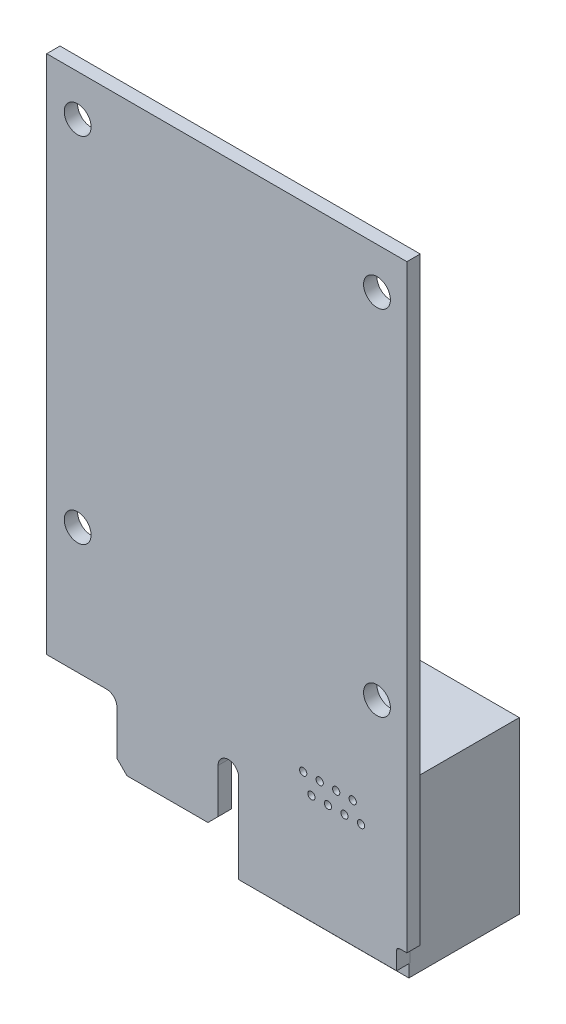
ISO-10303-21;
HEADER;
FILE_DESCRIPTION(('STEP AP214'),'2;1');
FILE_NAME('part.step','',(''),(''),'','','');
FILE_SCHEMA(('AUTOMOTIVE_DESIGN { 1 0 10303 214 1 1 1 1 }'));
ENDSEC;
DATA;
#1=APPLICATION_CONTEXT('core data for automotive mechanical design processes');
#2=APPLICATION_PROTOCOL_DEFINITION('international standard','automotive_design',2000,#1);
#3=PRODUCT_CONTEXT('',#1,'mechanical');
#4=PRODUCT('Part','Part','',(#3));
#5=PRODUCT_RELATED_PRODUCT_CATEGORY('part','',(#4));
#6=PRODUCT_DEFINITION_FORMATION('','',#4);
#7=PRODUCT_DEFINITION_CONTEXT('part definition',#1,'design');
#8=PRODUCT_DEFINITION('design','',#6,#7);
#9=PRODUCT_DEFINITION_SHAPE('','',#8);
#10=(LENGTH_UNIT() NAMED_UNIT(*) SI_UNIT(.MILLI.,.METRE.));
#11=(NAMED_UNIT(*) PLANE_ANGLE_UNIT() SI_UNIT($,.RADIAN.));
#12=(NAMED_UNIT(*) SI_UNIT($,.STERADIAN.) SOLID_ANGLE_UNIT());
#13=UNCERTAINTY_MEASURE_WITH_UNIT(LENGTH_MEASURE(1.E-05),#10,'distance_accuracy_value','');
#14=(GEOMETRIC_REPRESENTATION_CONTEXT(3) GLOBAL_UNCERTAINTY_ASSIGNED_CONTEXT((#13)) GLOBAL_UNIT_ASSIGNED_CONTEXT((#10,
#11,#12)) REPRESENTATION_CONTEXT('',''));
#15=CARTESIAN_POINT('',(0.,0.,0.));
#16=DIRECTION('',(0.,0.,1.));
#17=DIRECTION('',(1.,0.,0.));
#18=AXIS2_PLACEMENT_3D('',#15,#16,#17);
#19=CARTESIAN_POINT('',(-1.397,19.304,-15.2264872));
#20=DIRECTION('',(-1.,0.,0.));
#21=DIRECTION('',(0.,-1.,0.));
#22=AXIS2_PLACEMENT_3D('',#19,#20,#21);
#23=PLANE('',#22);
#24=DIRECTION('',(0.,-1.,0.));
#25=VECTOR('',#24,1.);
#26=CARTESIAN_POINT('',(-1.397,19.304,-1.6374872));
#27=LINE('',#26,#25);
#28=CARTESIAN_POINT('',(-1.397,19.304,-1.6374872));
#29=VERTEX_POINT('',#28);
#30=CARTESIAN_POINT('',(-1.397,0.,-1.6374872));
#31=VERTEX_POINT('',#30);
#32=EDGE_CURVE('E344',#29,#31,#27,.T.);
#33=ORIENTED_EDGE('',*,*,#32,.T.);
#34=CARTESIAN_POINT('',(-1.397,-1.651,-1.6374872));
#35=VERTEX_POINT('',#34);
#36=EDGE_CURVE('E332',#31,#35,#27,.T.);
#37=ORIENTED_EDGE('',*,*,#36,.T.);
#38=DIRECTION('',(0.,0.,1.));
#39=VECTOR('',#38,1.);
#40=CARTESIAN_POINT('',(-1.397,-1.651,-15.2264872));
#41=LINE('',#40,#39);
#42=CARTESIAN_POINT('',(-1.397,-1.651,-15.2264872));
#43=VERTEX_POINT('',#42);
#44=EDGE_CURVE('E362',#43,#35,#41,.T.);
#45=ORIENTED_EDGE('',*,*,#44,.F.);
#46=DIRECTION('',(0.,-1.,0.));
#47=VECTOR('',#46,1.);
#48=CARTESIAN_POINT('',(-1.397,19.304,-15.2264872));
#49=LINE('',#48,#47);
#50=CARTESIAN_POINT('',(-1.397,19.304,-15.2264872));
#51=VERTEX_POINT('',#50);
#52=EDGE_CURVE('E333',#51,#43,#49,.T.);
#53=ORIENTED_EDGE('',*,*,#52,.F.);
#54=DIRECTION('',(0.,0.,1.));
#55=VECTOR('',#54,1.);
#56=CARTESIAN_POINT('',(-1.397,19.304,-15.2264872));
#57=LINE('',#56,#55);
#58=EDGE_CURVE('E343',#51,#29,#57,.T.);
#59=ORIENTED_EDGE('',*,*,#58,.T.);
#60=EDGE_LOOP('',(#33,#37,#45,#53,#59));
#61=FACE_BOUND('',#60,.T.);
#62=ADVANCED_FACE('F39',(#61),#23,.F.);
#63=CARTESIAN_POINT('',(-1.397,-1.651,-15.2264872));
#64=DIRECTION('',(0.,1.,0.));
#65=DIRECTION('',(0.,0.,1.));
#66=AXIS2_PLACEMENT_3D('',#63,#64,#65);
#67=PLANE('',#66);
#68=DIRECTION('',(-1.,0.,0.));
#69=VECTOR('',#68,1.);
#70=CARTESIAN_POINT('',(-1.397,-1.651,-1.6374872));
#71=LINE('',#70,#69);
#72=CARTESIAN_POINT('',(-17.018,-1.651,-1.6374872));
#73=VERTEX_POINT('',#72);
#74=EDGE_CURVE('E347',#35,#73,#71,.T.);
#75=ORIENTED_EDGE('',*,*,#74,.T.);
#76=DIRECTION('',(0.,0.,1.));
#77=VECTOR('',#76,1.);
#78=CARTESIAN_POINT('',(-17.018,-1.651,-15.2264872));
#79=LINE('',#78,#77);
#80=CARTESIAN_POINT('',(-17.018,-1.651,-15.2264872));
#81=VERTEX_POINT('',#80);
#82=EDGE_CURVE('E359',#81,#73,#79,.T.);
#83=ORIENTED_EDGE('',*,*,#82,.F.);
#84=DIRECTION('',(-1.,0.,0.));
#85=VECTOR('',#84,1.);
#86=CARTESIAN_POINT('',(-1.397,-1.651,-15.2264872));
#87=LINE('',#86,#85);
#88=EDGE_CURVE('E336',#43,#81,#87,.T.);
#89=ORIENTED_EDGE('',*,*,#88,.F.);
#90=ORIENTED_EDGE('',*,*,#44,.T.);
#91=EDGE_LOOP('',(#75,#83,#89,#90));
#92=FACE_BOUND('',#91,.T.);
#93=ADVANCED_FACE('F465',(#92),#67,.F.);
#94=CARTESIAN_POINT('',(-17.018,19.304,-15.2264872));
#95=DIRECTION('',(1.,0.,0.));
#96=DIRECTION('',(0.,1.,0.));
#97=AXIS2_PLACEMENT_3D('',#94,#95,#96);
#98=PLANE('',#97);
#99=DIRECTION('',(0.,1.,0.));
#100=VECTOR('',#99,1.);
#101=CARTESIAN_POINT('',(-17.018,19.304,-1.6374872));
#102=LINE('',#101,#100);
#103=CARTESIAN_POINT('',(-17.018,0.,-1.6374872));
#104=VERTEX_POINT('',#103);
#105=EDGE_CURVE('E349',#73,#104,#102,.T.);
#106=ORIENTED_EDGE('',*,*,#105,.T.);
#107=DIRECTION('',(0.,1.,0.));
#108=VECTOR('',#107,1.);
#109=CARTESIAN_POINT('',(-17.018,19.304,-1.6374872));
#110=LINE('',#109,#108);
#111=CARTESIAN_POINT('',(-17.018,19.304,-1.6374872));
#112=VERTEX_POINT('',#111);
#113=EDGE_CURVE('E329',#104,#112,#110,.T.);
#114=ORIENTED_EDGE('',*,*,#113,.T.);
#115=DIRECTION('',(0.,0.,1.));
#116=VECTOR('',#115,1.);
#117=CARTESIAN_POINT('',(-17.018,19.304,-15.2264872));
#118=LINE('',#117,#116);
#119=CARTESIAN_POINT('',(-17.018,19.304,-15.2264872));
#120=VERTEX_POINT('',#119);
#121=EDGE_CURVE('E356',#120,#112,#118,.T.);
#122=ORIENTED_EDGE('',*,*,#121,.F.);
#123=DIRECTION('',(0.,1.,0.));
#124=VECTOR('',#123,1.);
#125=CARTESIAN_POINT('',(-17.018,19.304,-15.2264872));
#126=LINE('',#125,#124);
#127=EDGE_CURVE('E339',#81,#120,#126,.T.);
#128=ORIENTED_EDGE('',*,*,#127,.F.);
#129=ORIENTED_EDGE('',*,*,#82,.T.);
#130=EDGE_LOOP('',(#106,#114,#122,#128,#129));
#131=FACE_BOUND('',#130,.T.);
#132=ADVANCED_FACE('F471',(#131),#98,.F.);
#133=CARTESIAN_POINT('',(-1.397,19.304,-15.2264872));
#134=DIRECTION('',(0.,-1.,0.));
#135=DIRECTION('',(0.,0.,-1.));
#136=AXIS2_PLACEMENT_3D('',#133,#134,#135);
#137=PLANE('',#136);
#138=DIRECTION('',(1.,0.,0.));
#139=VECTOR('',#138,1.);
#140=CARTESIAN_POINT('',(-1.397,19.304,-1.6374872));
#141=LINE('',#140,#139);
#142=EDGE_CURVE('E337',#112,#29,#141,.T.);
#143=ORIENTED_EDGE('',*,*,#142,.T.);
#144=ORIENTED_EDGE('',*,*,#58,.F.);
#145=DIRECTION('',(1.,0.,0.));
#146=VECTOR('',#145,1.);
#147=CARTESIAN_POINT('',(-1.397,19.304,-15.2264872));
#148=LINE('',#147,#146);
#149=EDGE_CURVE('E341',#120,#51,#148,.T.);
#150=ORIENTED_EDGE('',*,*,#149,.F.);
#151=ORIENTED_EDGE('',*,*,#121,.T.);
#152=EDGE_LOOP('',(#143,#144,#150,#151));
#153=FACE_BOUND('',#152,.T.);
#154=ADVANCED_FACE('F476',(#153),#137,.F.);
#155=CARTESIAN_POINT('',(0.,0.,-15.2264872));
#156=DIRECTION('',(0.,0.,-1.));
#157=DIRECTION('',(-1.,0.,0.));
#158=AXIS2_PLACEMENT_3D('',#155,#156,#157);
#159=PLANE('',#158);
#160=ORIENTED_EDGE('',*,*,#52,.T.);
#161=ORIENTED_EDGE('',*,*,#88,.T.);
#162=ORIENTED_EDGE('',*,*,#127,.T.);
#163=ORIENTED_EDGE('',*,*,#149,.T.);
#164=EDGE_LOOP('',(#160,#161,#162,#163));
#165=FACE_BOUND('',#164,.T.);
#166=ADVANCED_FACE('F461',(#165),#159,.T.);
#167=CARTESIAN_POINT('',(0.,0.,-1.6374872));
#168=DIRECTION('',(0.,0.,-1.));
#169=DIRECTION('',(-1.,0.,0.));
#170=AXIS2_PLACEMENT_3D('',#167,#168,#169);
#171=PLANE('',#170);
#172=ORIENTED_EDGE('',*,*,#36,.F.);
#173=DIRECTION('',(-1.,0.,0.));
#174=VECTOR('',#173,1.);
#175=CARTESIAN_POINT('',(-41.783,0.,-1.6374872));
#176=LINE('',#175,#174);
#177=EDGE_CURVE('E323',#31,#104,#176,.T.);
#178=ORIENTED_EDGE('',*,*,#177,.T.);
#179=ORIENTED_EDGE('',*,*,#105,.F.);
#180=ORIENTED_EDGE('',*,*,#74,.F.);
#181=EDGE_LOOP('',(#172,#178,#179,#180));
#182=FACE_BOUND('',#181,.T.);
#183=ADVANCED_FACE('F448',(#182),#171,.F.);
#184=CARTESIAN_POINT('',(-41.783,5.4482365,-1.6374872));
#185=DIRECTION('',(0.,0.,-1.));
#186=DIRECTION('',(-1.,0.,0.));
#187=AXIS2_PLACEMENT_3D('',#184,#185,#186);
#188=PLANE('',#187);
#189=DIRECTION('',(-1.,0.,0.));
#190=VECTOR('',#189,1.);
#191=CARTESIAN_POINT('',(0.254,2.54,-1.6374872));
#192=LINE('',#191,#190);
#193=CARTESIAN_POINT('',(0.,2.54,-1.6374872));
#194=VERTEX_POINT('',#193);
#195=CARTESIAN_POINT('',(-0.888999999999999,2.54,-1.6374872));
#196=VERTEX_POINT('',#195);
#197=EDGE_CURVE('E195',#194,#196,#192,.T.);
#198=ORIENTED_EDGE('',*,*,#197,.T.);
#199=CARTESIAN_POINT('',(-0.888999999999999,2.159,-1.6374872));
#200=DIRECTION('',(0.,0.,-1.));
#201=DIRECTION('',(-1.,0.,0.));
#202=AXIS2_PLACEMENT_3D('',#199,#200,#201);
#203=CIRCLE('',#202,0.381);
#204=CARTESIAN_POINT('',(-1.27,2.159,-1.6374872));
#205=VERTEX_POINT('',#204);
#206=EDGE_CURVE('E184',#196,#205,#203,.F.);
#207=ORIENTED_EDGE('',*,*,#206,.T.);
#208=DIRECTION('',(0.,-1.,0.));
#209=VECTOR('',#208,1.);
#210=CARTESIAN_POINT('',(-1.27,-0.254,-1.6374872));
#211=LINE('',#210,#209);
#212=CARTESIAN_POINT('',(-1.27,0.,-1.6374872));
#213=VERTEX_POINT('',#212);
#214=EDGE_CURVE('E210',#205,#213,#211,.T.);
#215=ORIENTED_EDGE('',*,*,#214,.T.);
#216=EDGE_CURVE('E43',#213,#31,#176,.T.);
#217=ORIENTED_EDGE('',*,*,#216,.T.);
#218=ORIENTED_EDGE('',*,*,#32,.F.);
#219=ORIENTED_EDGE('',*,*,#142,.F.);
#220=ORIENTED_EDGE('',*,*,#113,.F.);
#221=CARTESIAN_POINT('',(-20.6989442868489,0.,-1.6374872));
#222=VERTEX_POINT('',#221);
#223=EDGE_CURVE('E64',#104,#222,#176,.T.);
#224=ORIENTED_EDGE('',*,*,#223,.T.);
#225=DIRECTION('',(0.,1.,0.));
#226=VECTOR('',#225,1.);
#227=CARTESIAN_POINT('',(-20.6989442868489,10.8966,-1.6374872));
#228=LINE('',#227,#226);
#229=CARTESIAN_POINT('',(-20.6989442868489,10.8966,-1.6374872));
#230=VERTEX_POINT('',#229);
#231=EDGE_CURVE('E217',#222,#230,#228,.T.);
#232=ORIENTED_EDGE('',*,*,#231,.T.);
#233=CARTESIAN_POINT('',(-21.9689442868489,10.8966,-1.6374872));
#234=DIRECTION('',(0.,0.,1.));
#235=DIRECTION('',(-1.,0.,0.));
#236=AXIS2_PLACEMENT_3D('',#233,#234,#235);
#237=CIRCLE('',#236,1.27);
#238=CARTESIAN_POINT('',(-23.2389442868489,10.8966,-1.6374872));
#239=VERTEX_POINT('',#238);
#240=EDGE_CURVE('E240',#230,#239,#237,.T.);
#241=ORIENTED_EDGE('',*,*,#240,.T.);
#242=DIRECTION('',(0.,-1.,0.));
#243=VECTOR('',#242,1.);
#244=CARTESIAN_POINT('',(-23.2389442868489,5.4356,-1.6374872));
#245=LINE('',#244,#243);
#246=CARTESIAN_POINT('',(-23.2389442868489,5.4356,-1.6374872));
#247=VERTEX_POINT('',#246);
#248=EDGE_CURVE('E237',#239,#247,#245,.T.);
#249=ORIENTED_EDGE('',*,*,#248,.T.);
#250=DIRECTION('',(-0.707106781186551,-0.707106781186544,0.));
#251=VECTOR('',#250,1.);
#252=CARTESIAN_POINT('',(-23.2389442868489,5.4356,-1.6374872));
#253=LINE('',#252,#251);
#254=CARTESIAN_POINT('',(-24.483544286849,4.191,-1.6374872));
#255=VERTEX_POINT('',#254);
#256=EDGE_CURVE('E234',#247,#255,#253,.T.);
#257=ORIENTED_EDGE('',*,*,#256,.T.);
#258=DIRECTION('',(-1.,0.,0.));
#259=VECTOR('',#258,1.);
#260=CARTESIAN_POINT('',(-34.440344286849,4.191,-1.6374872));
#261=LINE('',#260,#259);
#262=CARTESIAN_POINT('',(-34.440344286849,4.191,-1.6374872));
#263=VERTEX_POINT('',#262);
#264=EDGE_CURVE('E231',#255,#263,#261,.T.);
#265=ORIENTED_EDGE('',*,*,#264,.T.);
#266=DIRECTION('',(-0.707106781186544,0.707106781186551,0.));
#267=VECTOR('',#266,1.);
#268=CARTESIAN_POINT('',(-35.684944286849,5.4356,-1.6374872));
#269=LINE('',#268,#267);
#270=CARTESIAN_POINT('',(-35.684944286849,5.4356,-1.6374872));
#271=VERTEX_POINT('',#270);
#272=EDGE_CURVE('E228',#263,#271,#269,.T.);
#273=ORIENTED_EDGE('',*,*,#272,.T.);
#274=DIRECTION('',(0.,1.,0.));
#275=VECTOR('',#274,1.);
#276=CARTESIAN_POINT('',(-35.684944286849,10.8966,-1.6374872));
#277=LINE('',#276,#275);
#278=CARTESIAN_POINT('',(-35.684944286849,10.8966,-1.6374872));
#279=VERTEX_POINT('',#278);
#280=EDGE_CURVE('E225',#271,#279,#277,.T.);
#281=ORIENTED_EDGE('',*,*,#280,.T.);
#282=CARTESIAN_POINT('',(-36.954944286849,10.8966,-1.6374872));
#283=DIRECTION('',(0.,0.,1.));
#284=DIRECTION('',(-1.,0.,0.));
#285=AXIS2_PLACEMENT_3D('',#282,#283,#284);
#286=CIRCLE('',#285,1.27);
#287=CARTESIAN_POINT('',(-36.954944286849,12.1666,-1.6374872));
#288=VERTEX_POINT('',#287);
#289=EDGE_CURVE('E222',#279,#288,#286,.T.);
#290=ORIENTED_EDGE('',*,*,#289,.T.);
#291=DIRECTION('',(-1.,0.,0.));
#292=VECTOR('',#291,1.);
#293=CARTESIAN_POINT('',(-36.954944286849,12.1666,-1.6374872));
#294=LINE('',#293,#292);
#295=CARTESIAN_POINT('',(-44.323,12.1666,-1.6374872));
#296=VERTEX_POINT('',#295);
#297=EDGE_CURVE('E218',#288,#296,#294,.T.);
#298=ORIENTED_EDGE('',*,*,#297,.T.);
#299=DIRECTION('',(0.,1.,0.));
#300=VECTOR('',#299,1.);
#301=CARTESIAN_POINT('',(-44.323,5.4482365,-1.6374872));
#302=LINE('',#301,#300);
#303=CARTESIAN_POINT('',(-44.323,76.2,-1.6374872));
#304=VERTEX_POINT('',#303);
#305=EDGE_CURVE('E412',#296,#304,#302,.T.);
#306=ORIENTED_EDGE('',*,*,#305,.T.);
#307=DIRECTION('',(-1.,0.,0.));
#308=VECTOR('',#307,1.);
#309=CARTESIAN_POINT('',(-41.783,76.2,-1.6374872));
#310=LINE('',#309,#308);
#311=CARTESIAN_POINT('',(0.,76.2,-1.6374872));
#312=VERTEX_POINT('',#311);
#313=EDGE_CURVE('E546',#304,#312,#310,.F.);
#314=ORIENTED_EDGE('',*,*,#313,.T.);
#315=DIRECTION('',(0.,1.,0.));
#316=VECTOR('',#315,1.);
#317=CARTESIAN_POINT('',(0.,5.4482365,-1.6374872));
#318=LINE('',#317,#316);
#319=EDGE_CURVE('E204',#312,#194,#318,.F.);
#320=ORIENTED_EDGE('',*,*,#319,.T.);
#321=EDGE_LOOP('',(#198,#207,#215,#217,#218,#219,#220,#224,#232,#241,#249,#257,#265,#273,#281,
#290,#298,#306,#314,#320));
#322=FACE_BOUND('',#321,.T.);
#323=CARTESIAN_POINT('',(-3.68300000000001,71.12,-1.6374872));
#324=DIRECTION('',(0.,0.,-1.));
#325=DIRECTION('',(-1.,0.,0.));
#326=AXIS2_PLACEMENT_3D('',#323,#324,#325);
#327=CIRCLE('',#326,1.651);
#328=CARTESIAN_POINT('',(-5.334,71.12,-1.6374872));
#329=VERTEX_POINT('',#328);
#330=EDGE_CURVE('E307',#329,#329,#327,.T.);
#331=ORIENTED_EDGE('',*,*,#330,.F.);
#332=EDGE_LOOP('',(#331));
#333=FACE_BOUND('',#332,.T.);
#334=CARTESIAN_POINT('',(-3.68300000000001,27.6352,-1.6374872));
#335=DIRECTION('',(0.,0.,-1.));
#336=DIRECTION('',(-1.,0.,0.));
#337=AXIS2_PLACEMENT_3D('',#334,#335,#336);
#338=CIRCLE('',#337,1.651);
#339=CARTESIAN_POINT('',(-5.33400000000001,27.6352,-1.6374872));
#340=VERTEX_POINT('',#339);
#341=EDGE_CURVE('E304',#340,#340,#338,.T.);
#342=ORIENTED_EDGE('',*,*,#341,.F.);
#343=EDGE_LOOP('',(#342));
#344=FACE_BOUND('',#343,.T.);
#345=CARTESIAN_POINT('',(-40.513,27.6352,-1.6374872));
#346=DIRECTION('',(0.,0.,-1.));
#347=DIRECTION('',(-1.,0.,0.));
#348=AXIS2_PLACEMENT_3D('',#345,#346,#347);
#349=CIRCLE('',#348,1.651);
#350=CARTESIAN_POINT('',(-42.164,27.6352,-1.6374872));
#351=VERTEX_POINT('',#350);
#352=EDGE_CURVE('E296',#351,#351,#349,.T.);
#353=ORIENTED_EDGE('',*,*,#352,.F.);
#354=EDGE_LOOP('',(#353));
#355=FACE_BOUND('',#354,.T.);
#356=CARTESIAN_POINT('',(-40.513,71.12,-1.6374872));
#357=DIRECTION('',(0.,0.,-1.));
#358=DIRECTION('',(-1.,0.,0.));
#359=AXIS2_PLACEMENT_3D('',#356,#357,#358);
#360=CIRCLE('',#359,1.651);
#361=CARTESIAN_POINT('',(-42.164,71.12,-1.6374872));
#362=VERTEX_POINT('',#361);
#363=EDGE_CURVE('E313',#362,#362,#360,.T.);
#364=ORIENTED_EDGE('',*,*,#363,.F.);
#365=EDGE_LOOP('',(#364));
#366=FACE_BOUND('',#365,.T.);
#367=ADVANCED_FACE('F200',(#322,#333,#344,#355,#366),#188,.T.);
#368=CARTESIAN_POINT('',(-44.323,14.4652365,-1.6374872));
#369=DIRECTION('',(-1.,0.,0.));
#370=DIRECTION('',(0.,0.,1.));
#371=AXIS2_PLACEMENT_3D('',#368,#369,#370);
#372=PLANE('',#371);
#373=DIRECTION('',(0.,0.,1.));
#374=VECTOR('',#373,1.);
#375=CARTESIAN_POINT('',(-44.323,76.2,-1.6374872));
#376=LINE('',#375,#374);
#377=CARTESIAN_POINT('',(-44.323,76.2,0.));
#378=VERTEX_POINT('',#377);
#379=EDGE_CURVE('E403',#304,#378,#376,.T.);
#380=ORIENTED_EDGE('',*,*,#379,.F.);
#381=ORIENTED_EDGE('',*,*,#305,.F.);
#382=DIRECTION('',(0.,0.,-1.));
#383=VECTOR('',#382,1.);
#384=CARTESIAN_POINT('',(-44.323,12.1666,27.7225522722548));
#385=LINE('',#384,#383);
#386=CARTESIAN_POINT('',(-44.323,12.1666,1.47819500043167E-06));
#387=VERTEX_POINT('',#386);
#388=EDGE_CURVE('E251',#387,#296,#385,.T.);
#389=ORIENTED_EDGE('',*,*,#388,.F.);
#390=DIRECTION('',(0.,1.,0.));
#391=VECTOR('',#390,1.);
#392=CARTESIAN_POINT('',(-44.323,14.4652365,0.));
#393=LINE('',#392,#391);
#394=EDGE_CURVE('E315',#387,#378,#393,.T.);
#395=ORIENTED_EDGE('',*,*,#394,.T.);
#396=EDGE_LOOP('',(#380,#381,#389,#395));
#397=FACE_BOUND('',#396,.T.);
#398=ADVANCED_FACE('F542',(#397),#372,.T.);
#399=CARTESIAN_POINT('',(-44.323,76.2,-1.6374872));
#400=DIRECTION('',(0.,1.,0.));
#401=DIRECTION('',(0.,0.,1.));
#402=AXIS2_PLACEMENT_3D('',#399,#400,#401);
#403=PLANE('',#402);
#404=DIRECTION('',(0.,0.,-1.));
#405=VECTOR('',#404,1.);
#406=CARTESIAN_POINT('',(0.,76.2,-1.6374872));
#407=LINE('',#406,#405);
#408=CARTESIAN_POINT('',(0.,76.2,0.));
#409=VERTEX_POINT('',#408);
#410=EDGE_CURVE('E398',#312,#409,#407,.F.);
#411=ORIENTED_EDGE('',*,*,#410,.F.);
#412=ORIENTED_EDGE('',*,*,#313,.F.);
#413=ORIENTED_EDGE('',*,*,#379,.T.);
#414=DIRECTION('',(1.,0.,0.));
#415=VECTOR('',#414,1.);
#416=CARTESIAN_POINT('',(-44.323,76.2,0.));
#417=LINE('',#416,#415);
#418=EDGE_CURVE('E401',#378,#409,#417,.T.);
#419=ORIENTED_EDGE('',*,*,#418,.T.);
#420=EDGE_LOOP('',(#411,#412,#413,#419));
#421=FACE_BOUND('',#420,.T.);
#422=ADVANCED_FACE('F562',(#421),#403,.T.);
#423=CARTESIAN_POINT('',(0.,76.2,-1.6374872));
#424=DIRECTION('',(1.,0.,0.));
#425=DIRECTION('',(0.,0.,-1.));
#426=AXIS2_PLACEMENT_3D('',#423,#424,#425);
#427=PLANE('',#426);
#428=DIRECTION('',(0.,0.,1.));
#429=VECTOR('',#428,1.);
#430=CARTESIAN_POINT('',(0.,2.54,-1.6374872));
#431=LINE('',#430,#429);
#432=CARTESIAN_POINT('',(0.,2.54,0.));
#433=VERTEX_POINT('',#432);
#434=EDGE_CURVE('E215',#194,#433,#431,.T.);
#435=ORIENTED_EDGE('',*,*,#434,.F.);
#436=ORIENTED_EDGE('',*,*,#319,.F.);
#437=ORIENTED_EDGE('',*,*,#410,.T.);
#438=DIRECTION('',(0.,1.,0.));
#439=VECTOR('',#438,1.);
#440=CARTESIAN_POINT('',(0.,76.2,0.));
#441=LINE('',#440,#439);
#442=EDGE_CURVE('E390',#409,#433,#441,.F.);
#443=ORIENTED_EDGE('',*,*,#442,.T.);
#444=EDGE_LOOP('',(#435,#436,#437,#443));
#445=FACE_BOUND('',#444,.T.);
#446=ADVANCED_FACE('F559',(#445),#427,.T.);
#447=CARTESIAN_POINT('',(0.,0.,-1.6374872));
#448=DIRECTION('',(0.,-1.,0.));
#449=DIRECTION('',(0.,0.,-1.));
#450=AXIS2_PLACEMENT_3D('',#447,#448,#449);
#451=PLANE('',#450);
#452=DIRECTION('',(0.,0.,-1.));
#453=VECTOR('',#452,1.);
#454=CARTESIAN_POINT('',(-1.27,0.,-1.6374872));
#455=LINE('',#454,#453);
#456=CARTESIAN_POINT('',(-1.27,0.,0.));
#457=VERTEX_POINT('',#456);
#458=EDGE_CURVE('E211',#457,#213,#455,.T.);
#459=ORIENTED_EDGE('',*,*,#458,.F.);
#460=DIRECTION('',(1.,0.,0.));
#461=VECTOR('',#460,1.);
#462=CARTESIAN_POINT('',(0.,0.,0.));
#463=LINE('',#462,#461);
#464=CARTESIAN_POINT('',(-20.6989442868489,0.,1.47819500043167E-06));
#465=VERTEX_POINT('',#464);
#466=EDGE_CURVE('E388',#457,#465,#463,.F.);
#467=ORIENTED_EDGE('',*,*,#466,.T.);
#468=DIRECTION('',(0.,0.,-1.));
#469=VECTOR('',#468,1.);
#470=CARTESIAN_POINT('',(-20.6989442868489,0.,27.7225522722548));
#471=LINE('',#470,#469);
#472=EDGE_CURVE('E282',#465,#222,#471,.T.);
#473=ORIENTED_EDGE('',*,*,#472,.T.);
#474=ORIENTED_EDGE('',*,*,#223,.F.);
#475=ORIENTED_EDGE('',*,*,#177,.F.);
#476=ORIENTED_EDGE('',*,*,#216,.F.);
#477=EDGE_LOOP('',(#459,#467,#473,#474,#475,#476));
#478=FACE_BOUND('',#477,.T.);
#479=ADVANCED_FACE('F439',(#478),#451,.T.);
#480=CARTESIAN_POINT('',(-11.7475,13.4366,-1.6374872));
#481=DIRECTION('',(0.,0.,-1.));
#482=DIRECTION('',(-1.,0.,0.));
#483=AXIS2_PLACEMENT_3D('',#480,#481,#482);
#484=CYLINDRICAL_SURFACE('',#483,0.4445);
#485=CARTESIAN_POINT('',(-11.7475,13.4366,0.));
#486=DIRECTION('',(0.,0.,-1.));
#487=DIRECTION('',(-1.,0.,0.));
#488=AXIS2_PLACEMENT_3D('',#485,#486,#487);
#489=CIRCLE('',#488,0.4445);
#490=CARTESIAN_POINT('',(-12.192,13.4366,0.));
#491=VERTEX_POINT('',#490);
#492=EDGE_CURVE('E326',#491,#491,#489,.T.);
#493=ORIENTED_EDGE('',*,*,#492,.F.);
#494=EDGE_LOOP('',(#493));
#495=FACE_BOUND('',#494,.T.);
#496=CARTESIAN_POINT('',(-11.7475,13.4366,-1.6374872));
#497=DIRECTION('',(0.,0.,-1.));
#498=DIRECTION('',(-1.,0.,0.));
#499=AXIS2_PLACEMENT_3D('',#496,#497,#498);
#500=CIRCLE('',#499,0.4445);
#501=CARTESIAN_POINT('',(-12.192,13.4366,-1.6374872));
#502=VERTEX_POINT('',#501);
#503=EDGE_CURVE('E49',#502,#502,#500,.T.);
#504=ORIENTED_EDGE('',*,*,#503,.T.);
#505=EDGE_LOOP('',(#504));
#506=FACE_BOUND('',#505,.T.);
#507=ADVANCED_FACE('F435',(#495,#506),#484,.F.);
#508=CARTESIAN_POINT('',(-7.6835,13.4366,-1.6374872));
#509=DIRECTION('',(0.,0.,-1.));
#510=DIRECTION('',(-1.,0.,0.));
#511=AXIS2_PLACEMENT_3D('',#508,#509,#510);
#512=CYLINDRICAL_SURFACE('',#511,0.4445);
#513=CARTESIAN_POINT('',(-7.6835,13.4366,0.));
#514=DIRECTION('',(0.,0.,-1.));
#515=DIRECTION('',(-1.,0.,0.));
#516=AXIS2_PLACEMENT_3D('',#513,#514,#515);
#517=CIRCLE('',#516,0.4445);
#518=CARTESIAN_POINT('',(-8.128,13.4366,0.));
#519=VERTEX_POINT('',#518);
#520=EDGE_CURVE('E427',#519,#519,#517,.T.);
#521=ORIENTED_EDGE('',*,*,#520,.F.);
#522=EDGE_LOOP('',(#521));
#523=FACE_BOUND('',#522,.T.);
#524=CARTESIAN_POINT('',(-7.6835,13.4366,-1.6374872));
#525=DIRECTION('',(0.,0.,-1.));
#526=DIRECTION('',(-1.,0.,0.));
#527=AXIS2_PLACEMENT_3D('',#524,#525,#526);
#528=CIRCLE('',#527,0.4445);
#529=CARTESIAN_POINT('',(-8.128,13.4366,-1.6374872));
#530=VERTEX_POINT('',#529);
#531=EDGE_CURVE('E383',#530,#530,#528,.T.);
#532=ORIENTED_EDGE('',*,*,#531,.T.);
#533=EDGE_LOOP('',(#532));
#534=FACE_BOUND('',#533,.T.);
#535=ADVANCED_FACE('F438',(#523,#534),#512,.F.);
#536=CARTESIAN_POINT('',(-9.7155,13.43660254,-1.6374872));
#537=DIRECTION('',(0.,0.,-1.));
#538=DIRECTION('',(-1.,0.,0.));
#539=AXIS2_PLACEMENT_3D('',#536,#537,#538);
#540=CYLINDRICAL_SURFACE('',#539,0.4445);
#541=CARTESIAN_POINT('',(-9.7155,13.43660254,0.));
#542=DIRECTION('',(0.,0.,-1.));
#543=DIRECTION('',(-1.,0.,0.));
#544=AXIS2_PLACEMENT_3D('',#541,#542,#543);
#545=CIRCLE('',#544,0.4445);
#546=CARTESIAN_POINT('',(-10.16,13.43660254,0.));
#547=VERTEX_POINT('',#546);
#548=EDGE_CURVE('E425',#547,#547,#545,.T.);
#549=ORIENTED_EDGE('',*,*,#548,.F.);
#550=EDGE_LOOP('',(#549));
#551=FACE_BOUND('',#550,.T.);
#552=CARTESIAN_POINT('',(-9.7155,13.43660254,-1.6374872));
#553=DIRECTION('',(0.,0.,-1.));
#554=DIRECTION('',(-1.,0.,0.));
#555=AXIS2_PLACEMENT_3D('',#552,#553,#554);
#556=CIRCLE('',#555,0.4445);
#557=CARTESIAN_POINT('',(-10.16,13.43660254,-1.6374872));
#558=VERTEX_POINT('',#557);
#559=EDGE_CURVE('E380',#558,#558,#556,.T.);
#560=ORIENTED_EDGE('',*,*,#559,.T.);
#561=EDGE_LOOP('',(#560));
#562=FACE_BOUND('',#561,.T.);
#563=ADVANCED_FACE('F577',(#551,#562),#540,.F.);
#564=CARTESIAN_POINT('',(-12.7635,15.4686,-1.6374872));
#565=DIRECTION('',(0.,0.,-1.));
#566=DIRECTION('',(-1.,0.,0.));
#567=AXIS2_PLACEMENT_3D('',#564,#565,#566);
#568=CYLINDRICAL_SURFACE('',#567,0.4445);
#569=CARTESIAN_POINT('',(-12.7635,15.4686,0.));
#570=DIRECTION('',(0.,0.,-1.));
#571=DIRECTION('',(-1.,0.,0.));
#572=AXIS2_PLACEMENT_3D('',#569,#570,#571);
#573=CIRCLE('',#572,0.4445);
#574=CARTESIAN_POINT('',(-13.208,15.4686,0.));
#575=VERTEX_POINT('',#574);
#576=EDGE_CURVE('E422',#575,#575,#573,.T.);
#577=ORIENTED_EDGE('',*,*,#576,.F.);
#578=EDGE_LOOP('',(#577));
#579=FACE_BOUND('',#578,.T.);
#580=CARTESIAN_POINT('',(-12.7635,15.4686,-1.6374872));
#581=DIRECTION('',(0.,0.,-1.));
#582=DIRECTION('',(-1.,0.,0.));
#583=AXIS2_PLACEMENT_3D('',#580,#581,#582);
#584=CIRCLE('',#583,0.4445);
#585=CARTESIAN_POINT('',(-13.208,15.4686,-1.6374872));
#586=VERTEX_POINT('',#585);
#587=EDGE_CURVE('E377',#586,#586,#584,.T.);
#588=ORIENTED_EDGE('',*,*,#587,.T.);
#589=EDGE_LOOP('',(#588));
#590=FACE_BOUND('',#589,.T.);
#591=ADVANCED_FACE('F581',(#579,#590),#568,.F.);
#592=CARTESIAN_POINT('',(-8.6995,15.4686,-1.6374872));
#593=DIRECTION('',(0.,0.,-1.));
#594=DIRECTION('',(-1.,0.,0.));
#595=AXIS2_PLACEMENT_3D('',#592,#593,#594);
#596=CYLINDRICAL_SURFACE('',#595,0.4445);
#597=CARTESIAN_POINT('',(-8.6995,15.4686,0.));
#598=DIRECTION('',(0.,0.,-1.));
#599=DIRECTION('',(-1.,0.,0.));
#600=AXIS2_PLACEMENT_3D('',#597,#598,#599);
#601=CIRCLE('',#600,0.4445);
#602=CARTESIAN_POINT('',(-9.144,15.4686,0.));
#603=VERTEX_POINT('',#602);
#604=EDGE_CURVE('E419',#603,#603,#601,.T.);
#605=ORIENTED_EDGE('',*,*,#604,.F.);
#606=EDGE_LOOP('',(#605));
#607=FACE_BOUND('',#606,.T.);
#608=CARTESIAN_POINT('',(-8.6995,15.4686,-1.6374872));
#609=DIRECTION('',(0.,0.,-1.));
#610=DIRECTION('',(-1.,0.,0.));
#611=AXIS2_PLACEMENT_3D('',#608,#609,#610);
#612=CIRCLE('',#611,0.4445);
#613=CARTESIAN_POINT('',(-9.144,15.4686,-1.6374872));
#614=VERTEX_POINT('',#613);
#615=EDGE_CURVE('E374',#614,#614,#612,.T.);
#616=ORIENTED_EDGE('',*,*,#615,.T.);
#617=EDGE_LOOP('',(#616));
#618=FACE_BOUND('',#617,.T.);
#619=ADVANCED_FACE('F585',(#607,#618),#596,.F.);
#620=CARTESIAN_POINT('',(-10.7315,15.4686,-1.6374872));
#621=DIRECTION('',(0.,0.,-1.));
#622=DIRECTION('',(-1.,0.,0.));
#623=AXIS2_PLACEMENT_3D('',#620,#621,#622);
#624=CYLINDRICAL_SURFACE('',#623,0.4445);
#625=CARTESIAN_POINT('',(-10.7315,15.4686,0.));
#626=DIRECTION('',(0.,0.,-1.));
#627=DIRECTION('',(-1.,0.,0.));
#628=AXIS2_PLACEMENT_3D('',#625,#626,#627);
#629=CIRCLE('',#628,0.4445);
#630=CARTESIAN_POINT('',(-11.176,15.4686,0.));
#631=VERTEX_POINT('',#630);
#632=EDGE_CURVE('E416',#631,#631,#629,.T.);
#633=ORIENTED_EDGE('',*,*,#632,.F.);
#634=EDGE_LOOP('',(#633));
#635=FACE_BOUND('',#634,.T.);
#636=CARTESIAN_POINT('',(-10.7315,15.4686,-1.6374872));
#637=DIRECTION('',(0.,0.,-1.));
#638=DIRECTION('',(-1.,0.,0.));
#639=AXIS2_PLACEMENT_3D('',#636,#637,#638);
#640=CIRCLE('',#639,0.4445);
#641=CARTESIAN_POINT('',(-11.176,15.4686,-1.6374872));
#642=VERTEX_POINT('',#641);
#643=EDGE_CURVE('E371',#642,#642,#640,.T.);
#644=ORIENTED_EDGE('',*,*,#643,.T.);
#645=EDGE_LOOP('',(#644));
#646=FACE_BOUND('',#645,.T.);
#647=ADVANCED_FACE('F589',(#635,#646),#624,.F.);
#648=CARTESIAN_POINT('',(-6.6675,15.4686,-1.6374872));
#649=DIRECTION('',(0.,0.,-1.));
#650=DIRECTION('',(-1.,0.,0.));
#651=AXIS2_PLACEMENT_3D('',#648,#649,#650);
#652=CYLINDRICAL_SURFACE('',#651,0.4445);
#653=CARTESIAN_POINT('',(-6.6675,15.4686,0.));
#654=DIRECTION('',(0.,0.,-1.));
#655=DIRECTION('',(-1.,0.,0.));
#656=AXIS2_PLACEMENT_3D('',#653,#654,#655);
#657=CIRCLE('',#656,0.4445);
#658=CARTESIAN_POINT('',(-7.112,15.4686,0.));
#659=VERTEX_POINT('',#658);
#660=EDGE_CURVE('E413',#659,#659,#657,.T.);
#661=ORIENTED_EDGE('',*,*,#660,.F.);
#662=EDGE_LOOP('',(#661));
#663=FACE_BOUND('',#662,.T.);
#664=CARTESIAN_POINT('',(-6.6675,15.4686,-1.6374872));
#665=DIRECTION('',(0.,0.,-1.));
#666=DIRECTION('',(-1.,0.,0.));
#667=AXIS2_PLACEMENT_3D('',#664,#665,#666);
#668=CIRCLE('',#667,0.4445);
#669=CARTESIAN_POINT('',(-7.112,15.4686,-1.6374872));
#670=VERTEX_POINT('',#669);
#671=EDGE_CURVE('E368',#670,#670,#668,.T.);
#672=ORIENTED_EDGE('',*,*,#671,.T.);
#673=EDGE_LOOP('',(#672));
#674=FACE_BOUND('',#673,.T.);
#675=ADVANCED_FACE('F593',(#663,#674),#652,.F.);
#676=CARTESIAN_POINT('',(-5.6515,13.4366,-1.6374872));
#677=DIRECTION('',(0.,0.,-1.));
#678=DIRECTION('',(-1.,0.,0.));
#679=AXIS2_PLACEMENT_3D('',#676,#677,#678);
#680=CYLINDRICAL_SURFACE('',#679,0.4445);
#681=CARTESIAN_POINT('',(-5.6515,13.4366,0.));
#682=DIRECTION('',(0.,0.,-1.));
#683=DIRECTION('',(-1.,0.,0.));
#684=AXIS2_PLACEMENT_3D('',#681,#682,#683);
#685=CIRCLE('',#684,0.4445);
#686=CARTESIAN_POINT('',(-6.096,13.4366,0.));
#687=VERTEX_POINT('',#686);
#688=EDGE_CURVE('E409',#687,#687,#685,.T.);
#689=ORIENTED_EDGE('',*,*,#688,.F.);
#690=EDGE_LOOP('',(#689));
#691=FACE_BOUND('',#690,.T.);
#692=CARTESIAN_POINT('',(-5.6515,13.4366,-1.6374872));
#693=DIRECTION('',(0.,0.,-1.));
#694=DIRECTION('',(-1.,0.,0.));
#695=AXIS2_PLACEMENT_3D('',#692,#693,#694);
#696=CIRCLE('',#695,0.4445);
#697=CARTESIAN_POINT('',(-6.096,13.4366,-1.6374872));
#698=VERTEX_POINT('',#697);
#699=EDGE_CURVE('E365',#698,#698,#696,.T.);
#700=ORIENTED_EDGE('',*,*,#699,.T.);
#701=EDGE_LOOP('',(#700));
#702=FACE_BOUND('',#701,.T.);
#703=ADVANCED_FACE('F597',(#691,#702),#680,.F.);
#704=CARTESIAN_POINT('',(-14.92250292968,6.826759544189,1.47819499956431E-06));
#705=DIRECTION('',(0.,0.,1.));
#706=DIRECTION('',(1.,0.,0.));
#707=AXIS2_PLACEMENT_3D('',#704,#705,#706);
#708=PLANE('',#707);
#709=DIRECTION('',(-1.,0.,0.));
#710=VECTOR('',#709,1.);
#711=CARTESIAN_POINT('',(-14.92250292968,2.53999999999999,1.47819499956431E-06));
#712=LINE('',#711,#710);
#713=CARTESIAN_POINT('',(-0.888999999999999,2.54,0.));
#714=VERTEX_POINT('',#713);
#715=EDGE_CURVE('E11',#433,#714,#712,.T.);
#716=ORIENTED_EDGE('',*,*,#715,.F.);
#717=ORIENTED_EDGE('',*,*,#442,.F.);
#718=ORIENTED_EDGE('',*,*,#418,.F.);
#719=ORIENTED_EDGE('',*,*,#394,.F.);
#720=DIRECTION('',(-1.,0.,0.));
#721=VECTOR('',#720,1.);
#722=CARTESIAN_POINT('',(-36.954944286849,12.1666,1.47819500043167E-06));
#723=LINE('',#722,#721);
#724=CARTESIAN_POINT('',(-36.954944286849,12.1666,1.47819500043167E-06));
#725=VERTEX_POINT('',#724);
#726=EDGE_CURVE('E248',#725,#387,#723,.T.);
#727=ORIENTED_EDGE('',*,*,#726,.F.);
#728=CARTESIAN_POINT('',(-36.954944286849,10.8966,1.47819500043167E-06));
#729=DIRECTION('',(0.,0.,1.));
#730=DIRECTION('',(1.,0.,0.));
#731=AXIS2_PLACEMENT_3D('',#728,#729,#730);
#732=CIRCLE('',#731,1.27);
#733=CARTESIAN_POINT('',(-35.684944286849,10.8966,1.47819500043167E-06));
#734=VERTEX_POINT('',#733);
#735=EDGE_CURVE('E253',#734,#725,#732,.T.);
#736=ORIENTED_EDGE('',*,*,#735,.F.);
#737=DIRECTION('',(0.,1.,0.));
#738=VECTOR('',#737,1.);
#739=CARTESIAN_POINT('',(-35.684944286849,10.8966,1.47819500043167E-06));
#740=LINE('',#739,#738);
#741=CARTESIAN_POINT('',(-35.684944286849,5.4356,1.47819500043167E-06));
#742=VERTEX_POINT('',#741);
#743=EDGE_CURVE('E257',#742,#734,#740,.T.);
#744=ORIENTED_EDGE('',*,*,#743,.F.);
#745=DIRECTION('',(-0.707106781186544,0.707106781186551,0.));
#746=VECTOR('',#745,1.);
#747=CARTESIAN_POINT('',(-35.684944286849,5.4356,1.47819500043167E-06));
#748=LINE('',#747,#746);
#749=CARTESIAN_POINT('',(-34.440344286849,4.191,1.47819500043167E-06));
#750=VERTEX_POINT('',#749);
#751=EDGE_CURVE('E261',#750,#742,#748,.T.);
#752=ORIENTED_EDGE('',*,*,#751,.F.);
#753=DIRECTION('',(-1.,0.,0.));
#754=VECTOR('',#753,1.);
#755=CARTESIAN_POINT('',(-34.440344286849,4.191,1.47819500043167E-06));
#756=LINE('',#755,#754);
#757=CARTESIAN_POINT('',(-24.483544286849,4.191,1.47819500043167E-06));
#758=VERTEX_POINT('',#757);
#759=EDGE_CURVE('E265',#758,#750,#756,.T.);
#760=ORIENTED_EDGE('',*,*,#759,.F.);
#761=DIRECTION('',(-0.707106781186551,-0.707106781186544,0.));
#762=VECTOR('',#761,1.);
#763=CARTESIAN_POINT('',(-23.2389442868489,5.4356,1.47819500043167E-06));
#764=LINE('',#763,#762);
#765=CARTESIAN_POINT('',(-23.2389442868489,5.4356,1.47819500043167E-06));
#766=VERTEX_POINT('',#765);
#767=EDGE_CURVE('E269',#766,#758,#764,.T.);
#768=ORIENTED_EDGE('',*,*,#767,.F.);
#769=DIRECTION('',(0.,-1.,0.));
#770=VECTOR('',#769,1.);
#771=CARTESIAN_POINT('',(-23.2389442868489,5.4356,1.47819500043167E-06));
#772=LINE('',#771,#770);
#773=CARTESIAN_POINT('',(-23.238944286849,10.8966,1.47819500043167E-06));
#774=VERTEX_POINT('',#773);
#775=EDGE_CURVE('E273',#774,#766,#772,.T.);
#776=ORIENTED_EDGE('',*,*,#775,.F.);
#777=CARTESIAN_POINT('',(-21.9689442868489,10.8966,1.47819500043167E-06));
#778=DIRECTION('',(0.,0.,1.));
#779=DIRECTION('',(1.,0.,0.));
#780=AXIS2_PLACEMENT_3D('',#777,#778,#779);
#781=CIRCLE('',#780,1.27);
#782=CARTESIAN_POINT('',(-20.6989442868489,10.8966,1.47819500737056E-06));
#783=VERTEX_POINT('',#782);
#784=EDGE_CURVE('E277',#783,#774,#781,.T.);
#785=ORIENTED_EDGE('',*,*,#784,.F.);
#786=DIRECTION('',(0.,1.,0.));
#787=VECTOR('',#786,1.);
#788=CARTESIAN_POINT('',(-20.6989442868489,10.8966,1.47819500043167E-06));
#789=LINE('',#788,#787);
#790=EDGE_CURVE('E221',#465,#783,#789,.T.);
#791=ORIENTED_EDGE('',*,*,#790,.F.);
#792=ORIENTED_EDGE('',*,*,#466,.F.);
#793=DIRECTION('',(0.,-1.,0.));
#794=VECTOR('',#793,1.);
#795=CARTESIAN_POINT('',(-1.27,-0.254,0.));
#796=LINE('',#795,#794);
#797=CARTESIAN_POINT('',(-1.27,2.159,1.47819499956431E-06));
#798=VERTEX_POINT('',#797);
#799=EDGE_CURVE('E205',#798,#457,#796,.T.);
#800=ORIENTED_EDGE('',*,*,#799,.F.);
#801=CARTESIAN_POINT('',(-0.888999999999999,2.159,0.));
#802=DIRECTION('',(0.,0.,1.));
#803=DIRECTION('',(1.,0.,0.));
#804=AXIS2_PLACEMENT_3D('',#801,#802,#803);
#805=CIRCLE('',#804,0.381);
#806=EDGE_CURVE('E56',#714,#798,#805,.T.);
#807=ORIENTED_EDGE('',*,*,#806,.F.);
#808=EDGE_LOOP('',(#716,#717,#718,#719,#727,#736,#744,#752,#760,#768,#776,#785,#791,#792,#800,#807));
#809=FACE_BOUND('',#808,.T.);
#810=CARTESIAN_POINT('',(-3.68300000000001,71.12,0.));
#811=DIRECTION('',(0.,0.,1.));
#812=DIRECTION('',(1.,0.,0.));
#813=AXIS2_PLACEMENT_3D('',#810,#811,#812);
#814=CIRCLE('',#813,1.651);
#815=CARTESIAN_POINT('',(-2.03200000000001,71.12,0.));
#816=VERTEX_POINT('',#815);
#817=EDGE_CURVE('E293',#816,#816,#814,.T.);
#818=ORIENTED_EDGE('',*,*,#817,.F.);
#819=EDGE_LOOP('',(#818));
#820=FACE_BOUND('',#819,.T.);
#821=CARTESIAN_POINT('',(-3.68300000000001,27.6352,0.));
#822=DIRECTION('',(0.,0.,1.));
#823=DIRECTION('',(1.,0.,0.));
#824=AXIS2_PLACEMENT_3D('',#821,#822,#823);
#825=CIRCLE('',#824,1.651);
#826=CARTESIAN_POINT('',(-2.03200000000001,27.6352,0.));
#827=VERTEX_POINT('',#826);
#828=EDGE_CURVE('E297',#827,#827,#825,.T.);
#829=ORIENTED_EDGE('',*,*,#828,.F.);
#830=EDGE_LOOP('',(#829));
#831=FACE_BOUND('',#830,.T.);
#832=CARTESIAN_POINT('',(-40.513,27.6352,0.));
#833=DIRECTION('',(0.,0.,1.));
#834=DIRECTION('',(1.,0.,0.));
#835=AXIS2_PLACEMENT_3D('',#832,#833,#834);
#836=CIRCLE('',#835,1.651);
#837=CARTESIAN_POINT('',(-38.862,27.6352,0.));
#838=VERTEX_POINT('',#837);
#839=EDGE_CURVE('E292',#838,#838,#836,.T.);
#840=ORIENTED_EDGE('',*,*,#839,.F.);
#841=EDGE_LOOP('',(#840));
#842=FACE_BOUND('',#841,.T.);
#843=CARTESIAN_POINT('',(-40.513,71.12,0.));
#844=DIRECTION('',(0.,0.,1.));
#845=DIRECTION('',(1.,0.,0.));
#846=AXIS2_PLACEMENT_3D('',#843,#844,#845);
#847=CIRCLE('',#846,1.651);
#848=CARTESIAN_POINT('',(-38.862,71.12,0.));
#849=VERTEX_POINT('',#848);
#850=EDGE_CURVE('E310',#849,#849,#847,.T.);
#851=ORIENTED_EDGE('',*,*,#850,.F.);
#852=EDGE_LOOP('',(#851));
#853=FACE_BOUND('',#852,.T.);
#854=ORIENTED_EDGE('',*,*,#688,.T.);
#855=EDGE_LOOP('',(#854));
#856=FACE_BOUND('',#855,.T.);
#857=ORIENTED_EDGE('',*,*,#660,.T.);
#858=EDGE_LOOP('',(#857));
#859=FACE_BOUND('',#858,.T.);
#860=ORIENTED_EDGE('',*,*,#632,.T.);
#861=EDGE_LOOP('',(#860));
#862=FACE_BOUND('',#861,.T.);
#863=ORIENTED_EDGE('',*,*,#604,.T.);
#864=EDGE_LOOP('',(#863));
#865=FACE_BOUND('',#864,.T.);
#866=ORIENTED_EDGE('',*,*,#576,.T.);
#867=EDGE_LOOP('',(#866));
#868=FACE_BOUND('',#867,.T.);
#869=ORIENTED_EDGE('',*,*,#548,.T.);
#870=EDGE_LOOP('',(#869));
#871=FACE_BOUND('',#870,.T.);
#872=ORIENTED_EDGE('',*,*,#520,.T.);
#873=EDGE_LOOP('',(#872));
#874=FACE_BOUND('',#873,.T.);
#875=ORIENTED_EDGE('',*,*,#492,.T.);
#876=EDGE_LOOP('',(#875));
#877=FACE_BOUND('',#876,.T.);
#878=ADVANCED_FACE('F41',(#809,#820,#831,#842,#853,#856,#859,#862,#865,#868,#871,#874,#877),
#708,.T.);
#879=ORIENTED_EDGE('',*,*,#699,.F.);
#880=EDGE_LOOP('',(#879));
#881=FACE_BOUND('',#880,.T.);
#882=ADVANCED_FACE('F463',(#881),#171,.F.);
#883=ORIENTED_EDGE('',*,*,#671,.F.);
#884=EDGE_LOOP('',(#883));
#885=FACE_BOUND('',#884,.T.);
#886=ADVANCED_FACE('F748',(#885),#171,.F.);
#887=ORIENTED_EDGE('',*,*,#643,.F.);
#888=EDGE_LOOP('',(#887));
#889=FACE_BOUND('',#888,.T.);
#890=ADVANCED_FACE('F739',(#889),#171,.F.);
#891=ORIENTED_EDGE('',*,*,#615,.F.);
#892=EDGE_LOOP('',(#891));
#893=FACE_BOUND('',#892,.T.);
#894=ADVANCED_FACE('F730',(#893),#171,.F.);
#895=ORIENTED_EDGE('',*,*,#587,.F.);
#896=EDGE_LOOP('',(#895));
#897=FACE_BOUND('',#896,.T.);
#898=ADVANCED_FACE('F721',(#897),#171,.F.);
#899=ORIENTED_EDGE('',*,*,#559,.F.);
#900=EDGE_LOOP('',(#899));
#901=FACE_BOUND('',#900,.T.);
#902=ADVANCED_FACE('F456',(#901),#171,.F.);
#903=ORIENTED_EDGE('',*,*,#531,.F.);
#904=EDGE_LOOP('',(#903));
#905=FACE_BOUND('',#904,.T.);
#906=ADVANCED_FACE('F446',(#905),#171,.F.);
#907=ORIENTED_EDGE('',*,*,#503,.F.);
#908=EDGE_LOOP('',(#907));
#909=FACE_BOUND('',#908,.T.);
#910=ADVANCED_FACE('F443',(#909),#171,.F.);
#911=CARTESIAN_POINT('',(-40.513,71.12,-2.54));
#912=DIRECTION('',(0.,0.,1.));
#913=DIRECTION('',(1.,0.,0.));
#914=AXIS2_PLACEMENT_3D('',#911,#912,#913);
#915=CYLINDRICAL_SURFACE('',#914,1.651);
#916=ORIENTED_EDGE('',*,*,#363,.T.);
#917=EDGE_LOOP('',(#916));
#918=FACE_BOUND('',#917,.T.);
#919=ORIENTED_EDGE('',*,*,#850,.T.);
#920=EDGE_LOOP('',(#919));
#921=FACE_BOUND('',#920,.T.);
#922=ADVANCED_FACE('F445',(#918,#921),#915,.F.);
#923=CARTESIAN_POINT('',(-40.513,27.6352,-2.54));
#924=DIRECTION('',(0.,0.,1.));
#925=DIRECTION('',(1.,0.,0.));
#926=AXIS2_PLACEMENT_3D('',#923,#924,#925);
#927=CYLINDRICAL_SURFACE('',#926,1.651);
#928=ORIENTED_EDGE('',*,*,#352,.T.);
#929=EDGE_LOOP('',(#928));
#930=FACE_BOUND('',#929,.T.);
#931=ORIENTED_EDGE('',*,*,#839,.T.);
#932=EDGE_LOOP('',(#931));
#933=FACE_BOUND('',#932,.T.);
#934=ADVANCED_FACE('F453',(#930,#933),#927,.F.);
#935=CARTESIAN_POINT('',(-3.68300000000001,27.6352,-2.54));
#936=DIRECTION('',(0.,0.,1.));
#937=DIRECTION('',(1.,0.,0.));
#938=AXIS2_PLACEMENT_3D('',#935,#936,#937);
#939=CYLINDRICAL_SURFACE('',#938,1.651);
#940=ORIENTED_EDGE('',*,*,#341,.T.);
#941=EDGE_LOOP('',(#940));
#942=FACE_BOUND('',#941,.T.);
#943=ORIENTED_EDGE('',*,*,#828,.T.);
#944=EDGE_LOOP('',(#943));
#945=FACE_BOUND('',#944,.T.);
#946=ADVANCED_FACE('F605',(#942,#945),#939,.F.);
#947=CARTESIAN_POINT('',(-3.68300000000001,71.12,-2.54));
#948=DIRECTION('',(0.,0.,1.));
#949=DIRECTION('',(1.,0.,0.));
#950=AXIS2_PLACEMENT_3D('',#947,#948,#949);
#951=CYLINDRICAL_SURFACE('',#950,1.651);
#952=ORIENTED_EDGE('',*,*,#330,.T.);
#953=EDGE_LOOP('',(#952));
#954=FACE_BOUND('',#953,.T.);
#955=ORIENTED_EDGE('',*,*,#817,.T.);
#956=EDGE_LOOP('',(#955));
#957=FACE_BOUND('',#956,.T.);
#958=ADVANCED_FACE('F609',(#954,#957),#951,.F.);
#959=CARTESIAN_POINT('',(-20.6989442868489,10.8966,27.7225522722548));
#960=DIRECTION('',(-1.,0.,0.));
#961=DIRECTION('',(0.,-1.,0.));
#962=AXIS2_PLACEMENT_3D('',#959,#960,#961);
#963=PLANE('',#962);
#964=ORIENTED_EDGE('',*,*,#472,.F.);
#965=ORIENTED_EDGE('',*,*,#790,.T.);
#966=DIRECTION('',(0.,0.,-1.));
#967=VECTOR('',#966,1.);
#968=CARTESIAN_POINT('',(-20.6989442868489,10.8966,27.7225522722548));
#969=LINE('',#968,#967);
#970=EDGE_CURVE('E247',#783,#230,#969,.T.);
#971=ORIENTED_EDGE('',*,*,#970,.T.);
#972=ORIENTED_EDGE('',*,*,#231,.F.);
#973=EDGE_LOOP('',(#964,#965,#971,#972));
#974=FACE_BOUND('',#973,.T.);
#975=ADVANCED_FACE('F506',(#974),#963,.T.);
#976=CARTESIAN_POINT('',(-21.9689442868489,10.8966,27.7225522722548));
#977=DIRECTION('',(0.,0.,-1.));
#978=DIRECTION('',(-1.,0.,0.));
#979=AXIS2_PLACEMENT_3D('',#976,#977,#978);
#980=CYLINDRICAL_SURFACE('',#979,1.27);
#981=ORIENTED_EDGE('',*,*,#970,.F.);
#982=ORIENTED_EDGE('',*,*,#784,.T.);
#983=DIRECTION('',(0.,0.,-1.));
#984=VECTOR('',#983,1.);
#985=CARTESIAN_POINT('',(-23.2389442868489,10.8966,27.7225522722548));
#986=LINE('',#985,#984);
#987=EDGE_CURVE('E276',#774,#239,#986,.T.);
#988=ORIENTED_EDGE('',*,*,#987,.T.);
#989=ORIENTED_EDGE('',*,*,#240,.F.);
#990=EDGE_LOOP('',(#981,#982,#988,#989));
#991=FACE_BOUND('',#990,.T.);
#992=ADVANCED_FACE('F511',(#991),#980,.F.);
#993=CARTESIAN_POINT('',(-23.2389442868489,5.4356,27.7225522722548));
#994=DIRECTION('',(1.,0.,0.));
#995=DIRECTION('',(0.,0.,-1.));
#996=AXIS2_PLACEMENT_3D('',#993,#994,#995);
#997=PLANE('',#996);
#998=ORIENTED_EDGE('',*,*,#987,.F.);
#999=ORIENTED_EDGE('',*,*,#775,.T.);
#1000=DIRECTION('',(0.,0.,-1.));
#1001=VECTOR('',#1000,1.);
#1002=CARTESIAN_POINT('',(-23.2389442868489,5.4356,27.7225522722548));
#1003=LINE('',#1002,#1001);
#1004=EDGE_CURVE('E272',#766,#247,#1003,.T.);
#1005=ORIENTED_EDGE('',*,*,#1004,.T.);
#1006=ORIENTED_EDGE('',*,*,#248,.F.);
#1007=EDGE_LOOP('',(#998,#999,#1005,#1006));
#1008=FACE_BOUND('',#1007,.T.);
#1009=ADVANCED_FACE('F514',(#1008),#997,.T.);
#1010=CARTESIAN_POINT('',(-23.2389442868489,5.4356,27.7225522722548));
#1011=DIRECTION('',(0.707106781186544,-0.707106781186551,0.));
#1012=DIRECTION('',(0.707106781186551,0.707106781186544,0.));
#1013=AXIS2_PLACEMENT_3D('',#1010,#1011,#1012);
#1014=PLANE('',#1013);
#1015=ORIENTED_EDGE('',*,*,#1004,.F.);
#1016=ORIENTED_EDGE('',*,*,#767,.T.);
#1017=DIRECTION('',(0.,0.,-1.));
#1018=VECTOR('',#1017,1.);
#1019=CARTESIAN_POINT('',(-24.483544286849,4.191,27.7225522722548));
#1020=LINE('',#1019,#1018);
#1021=EDGE_CURVE('E268',#758,#255,#1020,.T.);
#1022=ORIENTED_EDGE('',*,*,#1021,.T.);
#1023=ORIENTED_EDGE('',*,*,#256,.F.);
#1024=EDGE_LOOP('',(#1015,#1016,#1022,#1023));
#1025=FACE_BOUND('',#1024,.T.);
#1026=ADVANCED_FACE('F518',(#1025),#1014,.T.);
#1027=CARTESIAN_POINT('',(-34.440344286849,4.191,27.7225522722548));
#1028=DIRECTION('',(0.,-1.,0.));
#1029=DIRECTION('',(1.,0.,0.));
#1030=AXIS2_PLACEMENT_3D('',#1027,#1028,#1029);
#1031=PLANE('',#1030);
#1032=ORIENTED_EDGE('',*,*,#1021,.F.);
#1033=ORIENTED_EDGE('',*,*,#759,.T.);
#1034=DIRECTION('',(0.,0.,-1.));
#1035=VECTOR('',#1034,1.);
#1036=CARTESIAN_POINT('',(-34.440344286849,4.191,27.7225522722548));
#1037=LINE('',#1036,#1035);
#1038=EDGE_CURVE('E264',#750,#263,#1037,.T.);
#1039=ORIENTED_EDGE('',*,*,#1038,.T.);
#1040=ORIENTED_EDGE('',*,*,#264,.F.);
#1041=EDGE_LOOP('',(#1032,#1033,#1039,#1040));
#1042=FACE_BOUND('',#1041,.T.);
#1043=ADVANCED_FACE('F523',(#1042),#1031,.T.);
#1044=CARTESIAN_POINT('',(-35.684944286849,5.4356,27.7225522722548));
#1045=DIRECTION('',(-0.707106781186551,-0.707106781186544,0.));
#1046=DIRECTION('',(0.707106781186544,-0.707106781186551,0.));
#1047=AXIS2_PLACEMENT_3D('',#1044,#1045,#1046);
#1048=PLANE('',#1047);
#1049=ORIENTED_EDGE('',*,*,#1038,.F.);
#1050=ORIENTED_EDGE('',*,*,#751,.T.);
#1051=DIRECTION('',(0.,0.,-1.));
#1052=VECTOR('',#1051,1.);
#1053=CARTESIAN_POINT('',(-35.684944286849,5.4356,27.7225522722548));
#1054=LINE('',#1053,#1052);
#1055=EDGE_CURVE('E260',#742,#271,#1054,.T.);
#1056=ORIENTED_EDGE('',*,*,#1055,.T.);
#1057=ORIENTED_EDGE('',*,*,#272,.F.);
#1058=EDGE_LOOP('',(#1049,#1050,#1056,#1057));
#1059=FACE_BOUND('',#1058,.T.);
#1060=ADVANCED_FACE('F526',(#1059),#1048,.T.);
#1061=CARTESIAN_POINT('',(-35.684944286849,10.8966,27.7225522722548));
#1062=DIRECTION('',(-1.,0.,0.));
#1063=DIRECTION('',(0.,0.,1.));
#1064=AXIS2_PLACEMENT_3D('',#1061,#1062,#1063);
#1065=PLANE('',#1064);
#1066=ORIENTED_EDGE('',*,*,#1055,.F.);
#1067=ORIENTED_EDGE('',*,*,#743,.T.);
#1068=DIRECTION('',(0.,0.,-1.));
#1069=VECTOR('',#1068,1.);
#1070=CARTESIAN_POINT('',(-35.684944286849,10.8966,27.7225522722548));
#1071=LINE('',#1070,#1069);
#1072=EDGE_CURVE('E256',#734,#279,#1071,.T.);
#1073=ORIENTED_EDGE('',*,*,#1072,.T.);
#1074=ORIENTED_EDGE('',*,*,#280,.F.);
#1075=EDGE_LOOP('',(#1066,#1067,#1073,#1074));
#1076=FACE_BOUND('',#1075,.T.);
#1077=ADVANCED_FACE('F530',(#1076),#1065,.T.);
#1078=CARTESIAN_POINT('',(-36.954944286849,10.8966,27.7225522722548));
#1079=DIRECTION('',(0.,0.,-1.));
#1080=DIRECTION('',(-1.,0.,0.));
#1081=AXIS2_PLACEMENT_3D('',#1078,#1079,#1080);
#1082=CYLINDRICAL_SURFACE('',#1081,1.27);
#1083=ORIENTED_EDGE('',*,*,#1072,.F.);
#1084=ORIENTED_EDGE('',*,*,#735,.T.);
#1085=DIRECTION('',(0.,0.,-1.));
#1086=VECTOR('',#1085,1.);
#1087=CARTESIAN_POINT('',(-36.954944286849,12.1666,27.7225522722548));
#1088=LINE('',#1087,#1086);
#1089=EDGE_CURVE('E252',#725,#288,#1088,.T.);
#1090=ORIENTED_EDGE('',*,*,#1089,.T.);
#1091=ORIENTED_EDGE('',*,*,#289,.F.);
#1092=EDGE_LOOP('',(#1083,#1084,#1090,#1091));
#1093=FACE_BOUND('',#1092,.T.);
#1094=ADVANCED_FACE('F536',(#1093),#1082,.F.);
#1095=CARTESIAN_POINT('',(-36.954944286849,12.1666,27.7225522722548));
#1096=DIRECTION('',(0.,-1.,0.));
#1097=DIRECTION('',(0.,0.,-1.));
#1098=AXIS2_PLACEMENT_3D('',#1095,#1096,#1097);
#1099=PLANE('',#1098);
#1100=ORIENTED_EDGE('',*,*,#1089,.F.);
#1101=ORIENTED_EDGE('',*,*,#726,.T.);
#1102=ORIENTED_EDGE('',*,*,#388,.T.);
#1103=ORIENTED_EDGE('',*,*,#297,.F.);
#1104=EDGE_LOOP('',(#1100,#1101,#1102,#1103));
#1105=FACE_BOUND('',#1104,.T.);
#1106=ADVANCED_FACE('F539',(#1105),#1099,.T.);
#1107=CARTESIAN_POINT('',(0.254,2.54,-4.82009807787998));
#1108=DIRECTION('',(0.,1.,0.));
#1109=DIRECTION('',(-1.,0.,0.));
#1110=AXIS2_PLACEMENT_3D('',#1107,#1108,#1109);
#1111=PLANE('',#1110);
#1112=ORIENTED_EDGE('',*,*,#434,.T.);
#1113=ORIENTED_EDGE('',*,*,#715,.T.);
#1114=DIRECTION('',(0.,0.,1.));
#1115=VECTOR('',#1114,1.);
#1116=CARTESIAN_POINT('',(-0.888999999999999,2.54,-4.82009807787998));
#1117=LINE('',#1116,#1115);
#1118=EDGE_CURVE('E187',#196,#714,#1117,.T.);
#1119=ORIENTED_EDGE('',*,*,#1118,.F.);
#1120=ORIENTED_EDGE('',*,*,#197,.F.);
#1121=EDGE_LOOP('',(#1112,#1113,#1119,#1120));
#1122=FACE_BOUND('',#1121,.T.);
#1123=ADVANCED_FACE('F194',(#1122),#1111,.F.);
#1124=CARTESIAN_POINT('',(-0.888999999999999,2.159,-4.82009807787998));
#1125=DIRECTION('',(0.,0.,1.));
#1126=DIRECTION('',(1.,0.,0.));
#1127=AXIS2_PLACEMENT_3D('',#1124,#1125,#1126);
#1128=CYLINDRICAL_SURFACE('',#1127,0.381);
#1129=ORIENTED_EDGE('',*,*,#1118,.T.);
#1130=ORIENTED_EDGE('',*,*,#806,.T.);
#1131=DIRECTION('',(0.,0.,1.));
#1132=VECTOR('',#1131,1.);
#1133=CARTESIAN_POINT('',(-1.27,2.159,-4.82009807787998));
#1134=LINE('',#1133,#1132);
#1135=EDGE_CURVE('E188',#205,#798,#1134,.T.);
#1136=ORIENTED_EDGE('',*,*,#1135,.F.);
#1137=ORIENTED_EDGE('',*,*,#206,.F.);
#1138=EDGE_LOOP('',(#1129,#1130,#1136,#1137));
#1139=FACE_BOUND('',#1138,.T.);
#1140=ADVANCED_FACE('F186',(#1139),#1128,.F.);
#1141=CARTESIAN_POINT('',(-1.27,-0.254,-4.82009807787998));
#1142=DIRECTION('',(-1.,0.,0.));
#1143=DIRECTION('',(0.,-1.,0.));
#1144=AXIS2_PLACEMENT_3D('',#1141,#1142,#1143);
#1145=PLANE('',#1144);
#1146=ORIENTED_EDGE('',*,*,#458,.T.);
#1147=ORIENTED_EDGE('',*,*,#214,.F.);
#1148=ORIENTED_EDGE('',*,*,#1135,.T.);
#1149=ORIENTED_EDGE('',*,*,#799,.T.);
#1150=EDGE_LOOP('',(#1146,#1147,#1148,#1149));
#1151=FACE_BOUND('',#1150,.T.);
#1152=ADVANCED_FACE('F498',(#1151),#1145,.F.);
#1153=CLOSED_SHELL('',(#62,#93,#132,#154,#166,#183,#367,#398,#422,#446,#479,#507,#535,#563,#591,
#619,#647,#675,#703,#878,#882,#886,#890,#894,#898,#902,#906,#910,#922,#934,#946,#958,#975,#992,
#1009,#1026,#1043,#1060,#1077,#1094,#1106,#1123,#1140,#1152));
#1154=MANIFOLD_SOLID_BREP('B2',#1153);
#1155=ADVANCED_BREP_SHAPE_REPRESENTATION('',(#18,#1154),#14);
#1156=SHAPE_DEFINITION_REPRESENTATION(#9,#1155);
ENDSEC;
END-ISO-10303-21;
